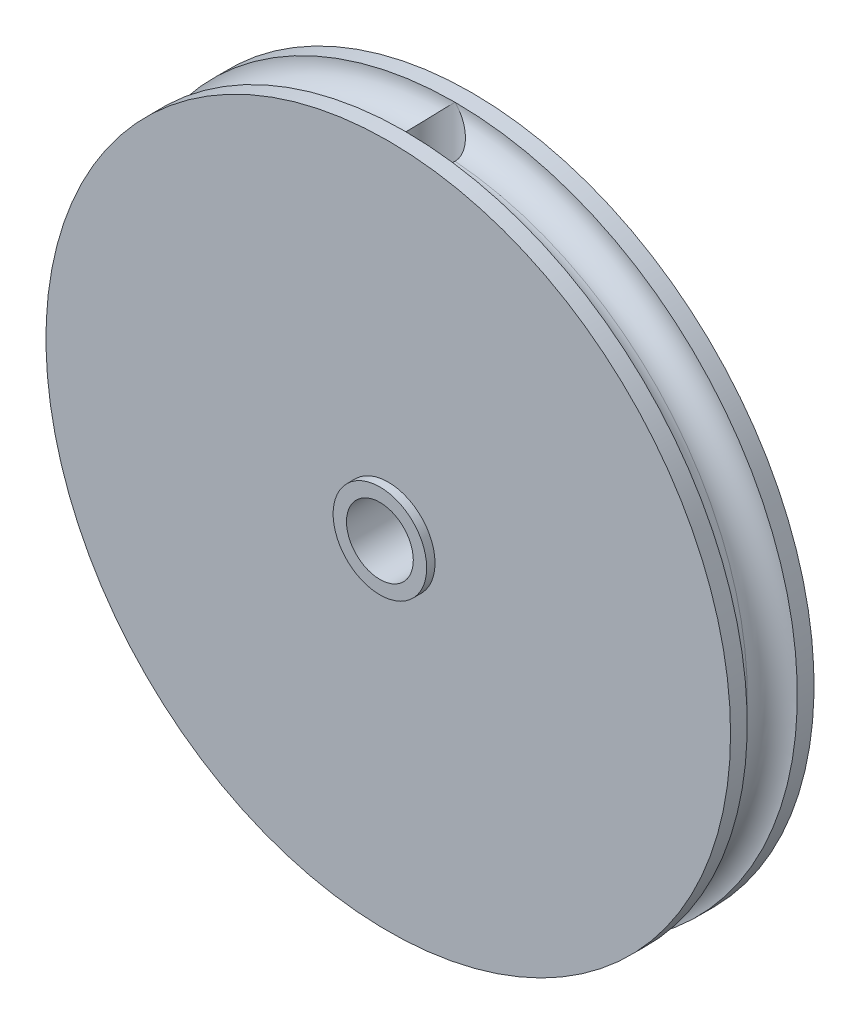
ISO-10303-21;
HEADER;
FILE_DESCRIPTION(('STEP AP214'),'2;1');
FILE_NAME('part.step','',(''),(''),'','','');
FILE_SCHEMA(('AUTOMOTIVE_DESIGN { 1 0 10303 214 1 1 1 1 }'));
ENDSEC;
DATA;
#1=APPLICATION_CONTEXT('core data for automotive mechanical design processes');
#2=APPLICATION_PROTOCOL_DEFINITION('international standard','automotive_design',2000,#1);
#3=PRODUCT_CONTEXT('',#1,'mechanical');
#4=PRODUCT('Part','Part','',(#3));
#5=PRODUCT_RELATED_PRODUCT_CATEGORY('part','',(#4));
#6=PRODUCT_DEFINITION_FORMATION('','',#4);
#7=PRODUCT_DEFINITION_CONTEXT('part definition',#1,'design');
#8=PRODUCT_DEFINITION('design','',#6,#7);
#9=PRODUCT_DEFINITION_SHAPE('','',#8);
#10=(LENGTH_UNIT() NAMED_UNIT(*) SI_UNIT(.MILLI.,.METRE.));
#11=(NAMED_UNIT(*) PLANE_ANGLE_UNIT() SI_UNIT($,.RADIAN.));
#12=(NAMED_UNIT(*) SI_UNIT($,.STERADIAN.) SOLID_ANGLE_UNIT());
#13=UNCERTAINTY_MEASURE_WITH_UNIT(LENGTH_MEASURE(1.E-05),#10,'distance_accuracy_value','');
#14=(GEOMETRIC_REPRESENTATION_CONTEXT(3) GLOBAL_UNCERTAINTY_ASSIGNED_CONTEXT((#13)) GLOBAL_UNIT_ASSIGNED_CONTEXT((#10,
#11,#12)) REPRESENTATION_CONTEXT('',''));
#15=CARTESIAN_POINT('',(0.,0.,0.));
#16=DIRECTION('',(0.,0.,1.));
#17=DIRECTION('',(1.,0.,0.));
#18=AXIS2_PLACEMENT_3D('',#15,#16,#17);
#19=CARTESIAN_POINT('',(0.,0.,-1.));
#20=DIRECTION('',(0.,0.,-1.));
#21=DIRECTION('',(-1.,0.,0.));
#22=AXIS2_PLACEMENT_3D('',#19,#20,#21);
#23=PLANE('',#22);
#24=CARTESIAN_POINT('',(0.,0.,-1.));
#25=DIRECTION('',(0.,0.,-1.));
#26=DIRECTION('',(-1.,0.,0.));
#27=AXIS2_PLACEMENT_3D('',#24,#25,#26);
#28=CIRCLE('',#27,20.5);
#29=CARTESIAN_POINT('',(-20.5,0.,-1.));
#30=VERTEX_POINT('',#29);
#31=EDGE_CURVE('E135',#30,#30,#28,.T.);
#32=ORIENTED_EDGE('',*,*,#31,.T.);
#33=EDGE_LOOP('',(#32));
#34=FACE_BOUND('',#33,.T.);
#35=CARTESIAN_POINT('',(0.,0.,-1.));
#36=DIRECTION('',(0.,0.,-1.));
#37=DIRECTION('',(-1.,0.,0.));
#38=AXIS2_PLACEMENT_3D('',#35,#36,#37);
#39=CIRCLE('',#38,2.8);
#40=CARTESIAN_POINT('',(-2.8,0.,-1.));
#41=VERTEX_POINT('',#40);
#42=EDGE_CURVE('E138',#41,#41,#39,.T.);
#43=ORIENTED_EDGE('',*,*,#42,.F.);
#44=EDGE_LOOP('',(#43));
#45=FACE_BOUND('',#44,.T.);
#46=ADVANCED_FACE('F37',(#34,#45),#23,.T.);
#47=CARTESIAN_POINT('',(0.,0.,4.));
#48=DIRECTION('',(0.,0.,1.));
#49=DIRECTION('',(1.,0.,0.));
#50=AXIS2_PLACEMENT_3D('',#47,#48,#49);
#51=PLANE('',#50);
#52=CARTESIAN_POINT('',(0.,0.,4.));
#53=DIRECTION('',(0.,0.,1.));
#54=DIRECTION('',(1.,0.,0.));
#55=AXIS2_PLACEMENT_3D('',#52,#53,#54);
#56=CIRCLE('',#55,20.5);
#57=CARTESIAN_POINT('',(20.5,0.,4.));
#58=VERTEX_POINT('',#57);
#59=EDGE_CURVE('E112',#58,#58,#56,.T.);
#60=ORIENTED_EDGE('',*,*,#59,.T.);
#61=EDGE_LOOP('',(#60));
#62=FACE_BOUND('',#61,.T.);
#63=CARTESIAN_POINT('',(0.,0.,4.));
#64=DIRECTION('',(0.,0.,1.));
#65=DIRECTION('',(1.,0.,0.));
#66=AXIS2_PLACEMENT_3D('',#63,#64,#65);
#67=CIRCLE('',#66,2.8);
#68=CARTESIAN_POINT('',(2.8,0.,4.));
#69=VERTEX_POINT('',#68);
#70=EDGE_CURVE('E151',#69,#69,#67,.T.);
#71=ORIENTED_EDGE('',*,*,#70,.F.);
#72=EDGE_LOOP('',(#71));
#73=FACE_BOUND('',#72,.T.);
#74=ADVANCED_FACE('F122',(#62,#73),#51,.T.);
#75=CARTESIAN_POINT('',(0.,0.,4.));
#76=DIRECTION('',(0.,0.,-1.));
#77=DIRECTION('',(-1.,0.,0.));
#78=AXIS2_PLACEMENT_3D('',#75,#76,#77);
#79=CYLINDRICAL_SURFACE('',#78,2.);
#80=CARTESIAN_POINT('',(0.,2.,0.));
#81=CARTESIAN_POINT('',(0.0732207358411543,1.99999540196395,4.79201202260337E-06));
#82=CARTESIAN_POINT('',(0.146561062021485,1.99593645526274,0.00540502437449589));
#83=CARTESIAN_POINT('',(0.290936396286467,1.98006607281083,0.0266670634101595));
#84=CARTESIAN_POINT('',(0.361965136229004,1.96823514679854,0.0425551716500548));
#85=CARTESIAN_POINT('',(0.499234626631249,1.9379567495606,0.0837129092837701));
#86=CARTESIAN_POINT('',(0.565501615403737,1.91954951932009,0.108925513569174));
#87=CARTESIAN_POINT('',(0.692422335520753,1.87750556721694,0.167542344187228));
#88=CARTESIAN_POINT('',(0.753077701796332,1.85387037535483,0.200944174193518));
#89=CARTESIAN_POINT('',(0.873465937590145,1.80049544543983,0.278263011590822));
#90=CARTESIAN_POINT('',(0.932593229272032,1.77039308548439,0.322867329334072));
#91=CARTESIAN_POINT('',(1.04302716767671,1.70767017883378,0.419495837361171));
#92=CARTESIAN_POINT('',(1.09432148272226,1.67504578078609,0.471531482799832));
#93=CARTESIAN_POINT('',(1.19837161436623,1.6027112365199,0.593582953278367));
#94=CARTESIAN_POINT('',(1.24930578421204,1.56290854864639,0.665103677121704));
#95=CARTESIAN_POINT('',(1.33861998176348,1.48711444664135,0.817451012366545));
#96=CARTESIAN_POINT('',(1.37701716983077,1.45111786883675,0.898264697000309));
#97=CARTESIAN_POINT('',(1.42880627811788,1.39977155180179,1.03950283867623));
#98=CARTESIAN_POINT('',(1.44625674456539,1.38157751186733,1.09739069712838));
#99=CARTESIAN_POINT('',(1.47420672564844,1.35171594150685,1.21639273478492));
#100=CARTESIAN_POINT('',(1.48472215355267,1.34003347910832,1.27749917787479));
#101=CARTESIAN_POINT('',(1.49812822141445,1.32503759684553,1.40218258553077));
#102=CARTESIAN_POINT('',(1.50094954854207,1.32180026676597,1.46577680672405));
#103=CARTESIAN_POINT('',(1.49848213241869,1.32459531776068,1.59261491088157));
#104=CARTESIAN_POINT('',(1.49319048157349,1.33063102218113,1.65585866008744));
#105=CARTESIAN_POINT('',(1.47597739291882,1.34967623262519,1.77319134742579));
#106=CARTESIAN_POINT('',(1.46482486380817,1.36187157059871,1.82753637104618));
#107=CARTESIAN_POINT('',(1.43705671120733,1.39114192844939,1.93343887872088));
#108=CARTESIAN_POINT('',(1.42043583681172,1.40822163640769,1.98499362782359));
#109=CARTESIAN_POINT('',(1.37033064172535,1.45741769294306,2.11625638663415));
#110=CARTESIAN_POINT('',(1.3328014849398,1.49225649139232,2.19340041664351));
#111=CARTESIAN_POINT('',(1.24618023314519,1.56533298145196,2.33919652386908));
#112=CARTESIAN_POINT('',(1.19706004255878,1.60357878886109,2.40782733925466));
#113=CARTESIAN_POINT('',(1.08651604102135,1.68051672313145,2.53775339040365));
#114=CARTESIAN_POINT('',(1.02481375526037,1.71919586730239,2.59882060688148));
#115=CARTESIAN_POINT('',(0.89042252170959,1.79248037980972,2.71026364678116));
#116=CARTESIAN_POINT('',(0.817755054293757,1.8270934826376,2.76065992023038));
#117=CARTESIAN_POINT('',(0.677902080454143,1.88279726073643,2.83998079924033));
#118=CARTESIAN_POINT('',(0.61253987018562,1.90520770945008,2.87118459421578));
#119=CARTESIAN_POINT('',(0.476352173202087,1.94372904416948,2.92422488046386));
#120=CARTESIAN_POINT('',(0.405530141063767,1.95984387504352,2.94606723849928));
#121=CARTESIAN_POINT('',(0.259676232483519,1.98445588635989,2.97925336288644));
#122=CARTESIAN_POINT('',(0.184621281405943,1.99290592971749,2.99053217893863));
#123=CARTESIAN_POINT('',(0.0332012397969175,2.00115883659445,3.00154959737171));
#124=CARTESIAN_POINT('',(-0.0431632843727232,2.00096534845408,3.00129306869537));
#125=CARTESIAN_POINT('',(-0.186804217329625,1.99242547175873,2.98988913072681));
#126=CARTESIAN_POINT('',(-0.254222327546133,1.98490086600401,2.97983946311133));
#127=CARTESIAN_POINT('',(-0.386110670609118,1.96351320201588,2.95102621999213));
#128=CARTESIAN_POINT('',(-0.450580272987261,1.94964879507262,2.93226079031059));
#129=CARTESIAN_POINT('',(-0.577416779689769,1.91599830683313,2.8861124694069));
#130=CARTESIAN_POINT('',(-0.639629172536138,1.89602050290193,2.8584488185726));
#131=CARTESIAN_POINT('',(-0.758518527043072,1.85166985411963,2.79582754457441));
#132=CARTESIAN_POINT('',(-0.815194721336403,1.82729640132068,2.76086891236027));
#133=CARTESIAN_POINT('',(-0.931511626319037,1.77119146886499,2.67821675358944));
#134=CARTESIAN_POINT('',(-0.990066762698702,1.73891095025037,2.62937146056254));
#135=CARTESIAN_POINT('',(-1.09871974855854,1.67238952874785,2.52399124741161));
#136=CARTESIAN_POINT('',(-1.14879830469577,1.63814438507395,2.46743930030664));
#137=CARTESIAN_POINT('',(-1.24877541075626,1.56369128291497,2.33585011903882));
#138=CARTESIAN_POINT('',(-1.29683043648705,1.52358718520101,2.2593424385077));
#139=CARTESIAN_POINT('',(-1.37923235998283,1.44940591348451,2.09663992202755));
#140=CARTESIAN_POINT('',(-1.41362000515519,1.41531099570969,2.01047487809143));
#141=CARTESIAN_POINT('',(-1.45615734256767,1.37118877808583,1.86458555112552));
#142=CARTESIAN_POINT('',(-1.46931009512996,1.35695811824565,1.80760887359762));
#143=CARTESIAN_POINT('',(-1.48891522181906,1.33542056103011,1.69129295301682));
#144=CARTESIAN_POINT('',(-1.4953825519924,1.32809821220233,1.63195929319775));
#145=CARTESIAN_POINT('',(-1.50115320209064,1.32157601792209,1.51217092018867));
#146=CARTESIAN_POINT('',(-1.50042015325262,1.32241740684975,1.45171205699043));
#147=CARTESIAN_POINT('',(-1.49176883838219,1.33216448543666,1.33194316124784));
#148=CARTESIAN_POINT('',(-1.48384130024585,1.34108058157484,1.27263471210274));
#149=CARTESIAN_POINT('',(-1.45893841819723,1.36817348797773,1.1440854285892));
#150=CARTESIAN_POINT('',(-1.44036567954111,1.38794705950643,1.07550281986723));
#151=CARTESIAN_POINT('',(-1.39469627266119,1.4338296338541,0.943465151169516));
#152=CARTESIAN_POINT('',(-1.3675780729773,1.4599546014693,0.880023557961812));
#153=CARTESIAN_POINT('',(-1.29498918933643,1.52516477328824,0.737479369513667));
#154=CARTESIAN_POINT('',(-1.2464154206597,1.56560203191105,0.660578417244247));
#155=CARTESIAN_POINT('',(-1.13650718465936,1.64713510181273,0.516873955022437));
#156=CARTESIAN_POINT('',(-1.07516134758577,1.68823146954222,0.450079534055154));
#157=CARTESIAN_POINT('',(-0.939627144937892,1.76728988939793,0.327168157716671));
#158=CARTESIAN_POINT('',(-0.865337161562861,1.80522333711072,0.271143680622806));
#159=CARTESIAN_POINT('',(-0.705159098936205,1.87357289668097,0.172776948854649));
#160=CARTESIAN_POINT('',(-0.619299420401795,1.90400691592959,0.130402025427495));
#161=CARTESIAN_POINT('',(-0.464840290356456,1.94636704624048,0.0722005790142935));
#162=CARTESIAN_POINT('',(-0.398553614774734,1.96110322499718,0.0522332686238256));
#163=CARTESIAN_POINT('',(-0.262841610392762,1.98383739970238,0.0215820973885094));
#164=CARTESIAN_POINT('',(-0.193425623834908,1.99185421210894,0.0108723097500385));
#165=CARTESIAN_POINT('',(-0.102963309861891,1.99745471706309,0.00339530578565107));
#166=CARTESIAN_POINT('',(-0.082406945994125,1.9984076143208,0.00212372251058427));
#167=CARTESIAN_POINT('',(-0.0412368896243789,1.99968095423138,0.000425326769030852));
#168=CARTESIAN_POINT('',(-0.0206231884283884,2.00000129507253,-1.34970737152924E-06));
#169=CARTESIAN_POINT('',(0.,2.,0.));
#170=B_SPLINE_CURVE_WITH_KNOTS('',3,(#80,#81,#82,#83,#84,#85,#86,#87,#88,#89,#90,#91,#92,#93,
#94,#95,#96,#97,#98,#99,#100,#101,#102,#103,#104,#105,#106,#107,#108,#109,#110,#111,#112,#113,
#114,#115,#116,#117,#118,#119,#120,#121,#122,#123,#124,#125,#126,#127,#128,#129,#130,#131,#132,
#133,#134,#135,#136,#137,#138,#139,#140,#141,#142,#143,#144,#145,#146,#147,#148,#149,#150,#151,
#152,#153,#154,#155,#156,#157,#158,#159,#160,#161,#162,#163,#164,#165,#166,#167,#168,#169),
.UNSPECIFIED.,.T.,.F.,(4,2,2,2,2,2,2,2,2,2,2,2,2,2,2,2,2,2,2,2,2,2,2,2,2,2,2,2,2,2,2,2,2,2,2,2,
2,2,2,2,2,2,2,2,4),(0.,0.219571786572042,0.439696319423244,0.658496333573381,0.877232398849293,
1.1162243131743,1.35558868405162,1.64360015887451,1.93121574056507,2.11999518529901,
2.3083399319529,2.49837587621257,2.6884799430021,2.85826890162709,3.0282213760064,
3.3044933180591,3.58144192357889,3.8653588393809,4.14872662493691,4.37526505006389,
4.60166129643117,4.82944058166898,5.05712372466613,5.26191187011994,5.46674360185812,
5.6788043948368,5.89089453977541,6.13840382081868,6.38646908985452,6.68168596015947,
6.97601595850112,7.15589161422933,7.33536399114208,7.51574333854741,7.69635548563854,
7.91639670960135,8.13699685139921,8.43412246655768,8.73151372390893,9.0313544949265,
9.33047220273164,9.5419569754163,9.75284752283256,9.81468166878711,9.87652576630966),.UNSPECIFIED.);
#171=CARTESIAN_POINT('',(0.,2.,0.));
#172=VERTEX_POINT('',#171);
#173=EDGE_CURVE('E100',#172,#172,#170,.T.);
#174=ORIENTED_EDGE('',*,*,#173,.F.);
#175=EDGE_LOOP('',(#174));
#176=FACE_BOUND('',#175,.T.);
#177=CARTESIAN_POINT('',(0.,0.,4.5));
#178=DIRECTION('',(0.,0.,1.));
#179=DIRECTION('',(1.,0.,0.));
#180=AXIS2_PLACEMENT_3D('',#177,#178,#179);
#181=CIRCLE('',#180,2.);
#182=CARTESIAN_POINT('',(2.,0.,4.5));
#183=VERTEX_POINT('',#182);
#184=EDGE_CURVE('E144',#183,#183,#181,.T.);
#185=ORIENTED_EDGE('',*,*,#184,.T.);
#186=EDGE_LOOP('',(#185));
#187=FACE_BOUND('',#186,.T.);
#188=CARTESIAN_POINT('',(0.,0.,-1.5));
#189=DIRECTION('',(0.,0.,-1.));
#190=DIRECTION('',(-1.,0.,0.));
#191=AXIS2_PLACEMENT_3D('',#188,#189,#190);
#192=CIRCLE('',#191,2.);
#193=CARTESIAN_POINT('',(-2.,0.,-1.5));
#194=VERTEX_POINT('',#193);
#195=EDGE_CURVE('E141',#194,#194,#192,.T.);
#196=ORIENTED_EDGE('',*,*,#195,.T.);
#197=EDGE_LOOP('',(#196));
#198=FACE_BOUND('',#197,.T.);
#199=ADVANCED_FACE('F94',(#176,#187,#198),#79,.F.);
#200=CARTESIAN_POINT('',(0.,0.,4.));
#201=DIRECTION('',(0.,0.,-1.));
#202=DIRECTION('',(-1.,0.,0.));
#203=AXIS2_PLACEMENT_3D('',#200,#201,#202);
#204=CYLINDRICAL_SURFACE('',#203,20.5);
#205=ORIENTED_EDGE('',*,*,#59,.F.);
#206=EDGE_LOOP('',(#205));
#207=FACE_BOUND('',#206,.T.);
#208=CARTESIAN_POINT('',(0.,0.,3.));
#209=DIRECTION('',(0.,0.,1.));
#210=DIRECTION('',(1.,0.,0.));
#211=AXIS2_PLACEMENT_3D('',#208,#209,#210);
#212=CIRCLE('',#211,20.5);
#213=CARTESIAN_POINT('',(0.,20.5,3.));
#214=VERTEX_POINT('',#213);
#215=EDGE_CURVE('E66',#214,#214,#212,.T.);
#216=ORIENTED_EDGE('',*,*,#215,.T.);
#217=EDGE_LOOP('',(#216));
#218=FACE_BOUND('',#217,.T.);
#219=ADVANCED_FACE('F117',(#207,#218),#204,.T.);
#220=CARTESIAN_POINT('',(0.,0.,-1.));
#221=DIRECTION('',(0.,0.,1.));
#222=DIRECTION('',(1.,0.,0.));
#223=AXIS2_PLACEMENT_3D('',#220,#221,#222);
#224=CYLINDRICAL_SURFACE('',#223,20.5);
#225=ORIENTED_EDGE('',*,*,#31,.F.);
#226=EDGE_LOOP('',(#225));
#227=FACE_BOUND('',#226,.T.);
#228=CARTESIAN_POINT('',(0.,0.,0.));
#229=DIRECTION('',(0.,0.,-1.));
#230=DIRECTION('',(-1.,0.,0.));
#231=AXIS2_PLACEMENT_3D('',#228,#229,#230);
#232=CIRCLE('',#231,20.5);
#233=CARTESIAN_POINT('',(0.,20.5,0.));
#234=VERTEX_POINT('',#233);
#235=EDGE_CURVE('E158',#234,#234,#232,.T.);
#236=ORIENTED_EDGE('',*,*,#235,.T.);
#237=EDGE_LOOP('',(#236));
#238=FACE_BOUND('',#237,.T.);
#239=ADVANCED_FACE('F91',(#227,#238),#224,.T.);
#240=CARTESIAN_POINT('',(0.,20.5,1.5));
#241=DIRECTION('',(0.,-1.,0.));
#242=DIRECTION('',(0.,0.,-1.));
#243=AXIS2_PLACEMENT_3D('',#240,#241,#242);
#244=CYLINDRICAL_SURFACE('',#243,1.5);
#245=CARTESIAN_POINT('',(-1.5,18.9406969248758,1.5));
#246=CARTESIAN_POINT('',(-1.50000879830353,18.9406869583156,1.46700162156007));
#247=CARTESIAN_POINT('',(-1.49891142469272,18.9418751092198,1.43401068428318));
#248=CARTESIAN_POINT('',(-1.49457234269412,18.9465707691481,1.36836606700722));
#249=CARTESIAN_POINT('',(-1.49133262323378,18.9500761269051,1.33571210269678));
#250=CARTESIAN_POINT('',(-1.48281744288391,18.9592854425843,1.27131022680939));
#251=CARTESIAN_POINT('',(-1.47756169894795,18.9649681056142,1.23955664322668));
#252=CARTESIAN_POINT('',(-1.46513272954799,18.9783983352455,1.17687716423226));
#253=CARTESIAN_POINT('',(-1.45795916812939,18.98614626363,1.14595141488201));
#254=CARTESIAN_POINT('',(-1.43382191160503,19.0121961474526,1.05494498011915));
#255=CARTESIAN_POINT('',(-1.41420196083709,19.0333472386929,0.996348775979359));
#256=CARTESIAN_POINT('',(-1.36909002194576,19.0818735715564,0.884148727346115));
#257=CARTESIAN_POINT('',(-1.34358287909426,19.1092648742478,0.830558277516448));
#258=CARTESIAN_POINT('',(-1.27517749560478,19.1825335074157,0.705614379996612));
#259=CARTESIAN_POINT('',(-1.22965210620724,19.231145560311,0.637300883260031));
#260=CARTESIAN_POINT('',(-1.13156254512432,19.3354254393582,0.512113948747138));
#261=CARTESIAN_POINT('',(-1.07898408885971,19.3911075719784,0.455264329543352));
#262=CARTESIAN_POINT('',(-0.945732521371845,19.5315568425509,0.330797469571159));
#263=CARTESIAN_POINT('',(-0.862515023156353,19.6187387881835,0.2686411940971));
#264=CARTESIAN_POINT('',(-0.689757492067029,19.7984358168692,0.164171618506324));
#265=CARTESIAN_POINT('',(-0.600210271415395,19.8909569402662,0.121881307765471));
#266=CARTESIAN_POINT('',(-0.426999495510468,20.0686338433181,0.0594400898207945));
#267=CARTESIAN_POINT('',(-0.343725068899767,20.1535245669585,0.0374109316956956));
#268=CARTESIAN_POINT('',(-0.175521649666241,20.3238983889381,0.00786693107230823));
#269=CARTESIAN_POINT('',(-0.0905966545104607,20.4093797949653,0.000320589508805275));
#270=CARTESIAN_POINT('',(-0.00365132701337396,20.4963484305662,3.33757138121831E-06));
#271=CARTESIAN_POINT('',(-0.00182570475454971,20.4981742967797,4.58616365577116E-09));
#272=CARTESIAN_POINT('',(0.,20.5,0.));
#273=B_SPLINE_CURVE_WITH_KNOTS('',3,(#245,#246,#247,#248,#249,#250,#251,#252,#253,#254,#255,
#256,#257,#258,#259,#260,#261,#262,#263,#264,#265,#266,#267,#268,#269,#270,#271,#272),
.UNSPECIFIED.,.F.,.F.,(4,2,2,2,2,2,2,2,2,2,2,2,2,4),(0.,0.0989434576957214,0.197795186226441,
0.295703816093586,0.393629608402421,0.588616408937209,0.784110853114283,1.06872873027154,
1.35393200132077,1.75857371914086,2.16368255157833,2.52564508071158,2.88681947172598,
2.89456544488897),.UNSPECIFIED.);
#274=CARTESIAN_POINT('',(-1.5,18.9406969248758,1.5));
#275=VERTEX_POINT('',#274);
#276=EDGE_CURVE('E69',#234,#275,#273,.F.);
#277=ORIENTED_EDGE('',*,*,#276,.T.);
#278=CARTESIAN_POINT('',(-1.5,18.9406969248758,1.5));
#279=CARTESIAN_POINT('',(-1.50000879830353,18.9406869583156,1.53299837843993));
#280=CARTESIAN_POINT('',(-1.49891142469272,18.9418751092198,1.56598931571682));
#281=CARTESIAN_POINT('',(-1.49457234269412,18.9465707691481,1.63163393299278));
#282=CARTESIAN_POINT('',(-1.49133262323378,18.9500761269051,1.66428789730322));
#283=CARTESIAN_POINT('',(-1.48281744288391,18.9592854425843,1.72868977319061));
#284=CARTESIAN_POINT('',(-1.47756169894795,18.9649681056142,1.76044335677332));
#285=CARTESIAN_POINT('',(-1.46513272954799,18.9783983352455,1.82312283576774));
#286=CARTESIAN_POINT('',(-1.45795916812939,18.98614626363,1.85404858511799));
#287=CARTESIAN_POINT('',(-1.43382191160503,19.0121961474526,1.94505501988085));
#288=CARTESIAN_POINT('',(-1.41420196083709,19.0333472386929,2.00365122402064));
#289=CARTESIAN_POINT('',(-1.36909002194576,19.0818735715564,2.11585127265388));
#290=CARTESIAN_POINT('',(-1.34358287909426,19.1092648742478,2.16944172248355));
#291=CARTESIAN_POINT('',(-1.27517749560478,19.1825335074157,2.29438562000339));
#292=CARTESIAN_POINT('',(-1.22965210620724,19.231145560311,2.36269911673997));
#293=CARTESIAN_POINT('',(-1.13156254512432,19.3354254393582,2.48788605125286));
#294=CARTESIAN_POINT('',(-1.07898408885971,19.3911075719784,2.54473567045665));
#295=CARTESIAN_POINT('',(-0.945732521371846,19.5315568425509,2.66920253042884));
#296=CARTESIAN_POINT('',(-0.862515023156355,19.6187387881835,2.7313588059029));
#297=CARTESIAN_POINT('',(-0.689757492067027,19.7984358168692,2.83582838149368));
#298=CARTESIAN_POINT('',(-0.600210271415386,19.8909569402662,2.87811869223453));
#299=CARTESIAN_POINT('',(-0.426999495510477,20.0686338433182,2.94055991017921));
#300=CARTESIAN_POINT('',(-0.343725068899797,20.1535245669585,2.9625890683043));
#301=CARTESIAN_POINT('',(-0.175521649666207,20.3238983889381,2.99213306892769));
#302=CARTESIAN_POINT('',(-0.09059665451034,20.4093797949652,2.9996794104912));
#303=CARTESIAN_POINT('',(-0.00365132701336847,20.4963484305662,2.99999666242862));
#304=CARTESIAN_POINT('',(-0.00182570475454691,20.4981742967797,2.99999999541384));
#305=CARTESIAN_POINT('',(0.,20.5,3.));
#306=B_SPLINE_CURVE_WITH_KNOTS('',3,(#278,#279,#280,#281,#282,#283,#284,#285,#286,#287,#288,
#289,#290,#291,#292,#293,#294,#295,#296,#297,#298,#299,#300,#301,#302,#303,#304,#305),
.UNSPECIFIED.,.F.,.F.,(4,2,2,2,2,2,2,2,2,2,2,2,2,4),(0.,0.0989434576957212,0.197795186226441,
0.295703816093586,0.393629608402421,0.588616408937209,0.784110853114282,1.06872873027154,
1.35393200132077,1.75857371914086,2.16368255157833,2.52564508071158,2.88681947172598,
2.89456544488897),.UNSPECIFIED.);
#307=EDGE_CURVE('E11',#275,#214,#306,.T.);
#308=ORIENTED_EDGE('',*,*,#307,.T.);
#309=CARTESIAN_POINT('',(1.5,18.9406969248758,1.5));
#310=CARTESIAN_POINT('',(1.50000879830353,18.9406869583156,1.53299837843993));
#311=CARTESIAN_POINT('',(1.49891142469272,18.9418751092198,1.56598931571682));
#312=CARTESIAN_POINT('',(1.49457234269412,18.9465707691481,1.63163393299278));
#313=CARTESIAN_POINT('',(1.49133262323378,18.9500761269051,1.66428789730322));
#314=CARTESIAN_POINT('',(1.48281744288391,18.9592854425843,1.72868977319061));
#315=CARTESIAN_POINT('',(1.47756169894795,18.9649681056142,1.76044335677332));
#316=CARTESIAN_POINT('',(1.46513272954799,18.9783983352455,1.82312283576774));
#317=CARTESIAN_POINT('',(1.45795916812939,18.98614626363,1.85404858511799));
#318=CARTESIAN_POINT('',(1.43382191160503,19.0121961474526,1.94505501988085));
#319=CARTESIAN_POINT('',(1.41420196083709,19.0333472386929,2.00365122402064));
#320=CARTESIAN_POINT('',(1.36909002194576,19.0818735715564,2.11585127265388));
#321=CARTESIAN_POINT('',(1.34358287909426,19.1092648742478,2.16944172248355));
#322=CARTESIAN_POINT('',(1.27517749560478,19.1825335074157,2.29438562000339));
#323=CARTESIAN_POINT('',(1.22965210620724,19.231145560311,2.36269911673997));
#324=CARTESIAN_POINT('',(1.13156254512432,19.3354254393582,2.48788605125286));
#325=CARTESIAN_POINT('',(1.07898408885971,19.3911075719784,2.54473567045665));
#326=CARTESIAN_POINT('',(0.945732521371846,19.5315568425509,2.66920253042884));
#327=CARTESIAN_POINT('',(0.862515023156355,19.6187387881835,2.7313588059029));
#328=CARTESIAN_POINT('',(0.689757492067027,19.7984358168692,2.83582838149368));
#329=CARTESIAN_POINT('',(0.600210271415386,19.8909569402662,2.87811869223453));
#330=CARTESIAN_POINT('',(0.426999495510477,20.0686338433182,2.94055991017921));
#331=CARTESIAN_POINT('',(0.343725068899797,20.1535245669585,2.9625890683043));
#332=CARTESIAN_POINT('',(0.175521649666207,20.3238983889381,2.99213306892769));
#333=CARTESIAN_POINT('',(0.09059665451034,20.4093797949652,2.9996794104912));
#334=CARTESIAN_POINT('',(0.00365132701336847,20.4963484305662,2.99999666242862));
#335=CARTESIAN_POINT('',(0.00182570475454691,20.4981742967797,2.99999999541384));
#336=CARTESIAN_POINT('',(0.,20.5,3.));
#337=B_SPLINE_CURVE_WITH_KNOTS('',3,(#309,#310,#311,#312,#313,#314,#315,#316,#317,#318,#319,
#320,#321,#322,#323,#324,#325,#326,#327,#328,#329,#330,#331,#332,#333,#334,#335,#336),
.UNSPECIFIED.,.F.,.F.,(4,2,2,2,2,2,2,2,2,2,2,2,2,4),(0.,0.0989434576957212,0.197795186226441,
0.295703816093586,0.393629608402421,0.588616408937209,0.784110853114282,1.06872873027154,
1.35393200132077,1.75857371914086,2.16368255157833,2.52564508071158,2.88681947172598,
2.89456544488897),.UNSPECIFIED.);
#338=CARTESIAN_POINT('',(1.5,18.9406969248758,1.5));
#339=VERTEX_POINT('',#338);
#340=EDGE_CURVE('E47',#214,#339,#337,.F.);
#341=ORIENTED_EDGE('',*,*,#340,.T.);
#342=CARTESIAN_POINT('',(1.5,18.9406969248758,1.5));
#343=CARTESIAN_POINT('',(1.50000879830353,18.9406869583156,1.46700162156007));
#344=CARTESIAN_POINT('',(1.49891142469272,18.9418751092198,1.43401068428318));
#345=CARTESIAN_POINT('',(1.49457234269412,18.9465707691481,1.36836606700722));
#346=CARTESIAN_POINT('',(1.49133262323378,18.9500761269051,1.33571210269678));
#347=CARTESIAN_POINT('',(1.48281744288391,18.9592854425843,1.27131022680939));
#348=CARTESIAN_POINT('',(1.47756169894795,18.9649681056142,1.23955664322668));
#349=CARTESIAN_POINT('',(1.46513272954799,18.9783983352455,1.17687716423226));
#350=CARTESIAN_POINT('',(1.45795916812939,18.98614626363,1.14595141488201));
#351=CARTESIAN_POINT('',(1.43382191160503,19.0121961474526,1.05494498011915));
#352=CARTESIAN_POINT('',(1.41420196083709,19.0333472386929,0.996348775979359));
#353=CARTESIAN_POINT('',(1.36909002194576,19.0818735715564,0.884148727346115));
#354=CARTESIAN_POINT('',(1.34358287909426,19.1092648742478,0.830558277516448));
#355=CARTESIAN_POINT('',(1.27517749560478,19.1825335074157,0.705614379996612));
#356=CARTESIAN_POINT('',(1.22965210620724,19.231145560311,0.637300883260031));
#357=CARTESIAN_POINT('',(1.13156254512432,19.3354254393582,0.512113948747138));
#358=CARTESIAN_POINT('',(1.07898408885971,19.3911075719784,0.455264329543352));
#359=CARTESIAN_POINT('',(0.945732521371845,19.5315568425509,0.330797469571159));
#360=CARTESIAN_POINT('',(0.862515023156353,19.6187387881835,0.2686411940971));
#361=CARTESIAN_POINT('',(0.689757492067029,19.7984358168692,0.164171618506324));
#362=CARTESIAN_POINT('',(0.600210271415395,19.8909569402662,0.121881307765471));
#363=CARTESIAN_POINT('',(0.426999495510468,20.0686338433181,0.0594400898207945));
#364=CARTESIAN_POINT('',(0.343725068899767,20.1535245669585,0.0374109316956956));
#365=CARTESIAN_POINT('',(0.175521649666241,20.3238983889381,0.00786693107230823));
#366=CARTESIAN_POINT('',(0.0905966545104607,20.4093797949653,0.000320589508805275));
#367=CARTESIAN_POINT('',(0.00365132701337396,20.4963484305662,3.33757138121831E-06));
#368=CARTESIAN_POINT('',(0.00182570475454971,20.4981742967797,4.58616365577116E-09));
#369=CARTESIAN_POINT('',(0.,20.5,0.));
#370=B_SPLINE_CURVE_WITH_KNOTS('',3,(#342,#343,#344,#345,#346,#347,#348,#349,#350,#351,#352,
#353,#354,#355,#356,#357,#358,#359,#360,#361,#362,#363,#364,#365,#366,#367,#368,#369),
.UNSPECIFIED.,.F.,.F.,(4,2,2,2,2,2,2,2,2,2,2,2,2,4),(0.,0.0989434576957214,0.197795186226441,
0.295703816093586,0.393629608402421,0.588616408937209,0.784110853114283,1.06872873027154,
1.35393200132077,1.75857371914086,2.16368255157833,2.52564508071158,2.88681947172598,
2.89456544488897),.UNSPECIFIED.);
#371=EDGE_CURVE('E67',#339,#234,#370,.T.);
#372=ORIENTED_EDGE('',*,*,#371,.T.);
#373=EDGE_LOOP('',(#277,#308,#341,#372));
#374=FACE_BOUND('',#373,.T.);
#375=ORIENTED_EDGE('',*,*,#173,.T.);
#376=EDGE_LOOP('',(#375));
#377=FACE_BOUND('',#376,.T.);
#378=ADVANCED_FACE('F85',(#374,#377),#244,.F.);
#379=CARTESIAN_POINT('',(0.,0.,4.5));
#380=DIRECTION('',(0.,0.,1.));
#381=DIRECTION('',(1.,0.,0.));
#382=AXIS2_PLACEMENT_3D('',#379,#380,#381);
#383=PLANE('',#382);
#384=CARTESIAN_POINT('',(0.,0.,4.5));
#385=DIRECTION('',(0.,0.,1.));
#386=DIRECTION('',(1.,0.,0.));
#387=AXIS2_PLACEMENT_3D('',#384,#385,#386);
#388=CIRCLE('',#387,2.8);
#389=CARTESIAN_POINT('',(2.8,0.,4.5));
#390=VERTEX_POINT('',#389);
#391=EDGE_CURVE('E152',#390,#390,#388,.T.);
#392=ORIENTED_EDGE('',*,*,#391,.T.);
#393=EDGE_LOOP('',(#392));
#394=FACE_BOUND('',#393,.T.);
#395=ORIENTED_EDGE('',*,*,#184,.F.);
#396=EDGE_LOOP('',(#395));
#397=FACE_BOUND('',#396,.T.);
#398=ADVANCED_FACE('F90',(#394,#397),#383,.T.);
#399=CARTESIAN_POINT('',(0.,0.,4.5));
#400=DIRECTION('',(0.,0.,-1.));
#401=DIRECTION('',(-1.,0.,0.));
#402=AXIS2_PLACEMENT_3D('',#399,#400,#401);
#403=CYLINDRICAL_SURFACE('',#402,2.8);
#404=ORIENTED_EDGE('',*,*,#391,.F.);
#405=EDGE_LOOP('',(#404));
#406=FACE_BOUND('',#405,.T.);
#407=ORIENTED_EDGE('',*,*,#70,.T.);
#408=EDGE_LOOP('',(#407));
#409=FACE_BOUND('',#408,.T.);
#410=ADVANCED_FACE('F92',(#406,#409),#403,.T.);
#411=CARTESIAN_POINT('',(0.,0.,-1.5));
#412=DIRECTION('',(0.,0.,-1.));
#413=DIRECTION('',(-1.,0.,0.));
#414=AXIS2_PLACEMENT_3D('',#411,#412,#413);
#415=PLANE('',#414);
#416=CARTESIAN_POINT('',(0.,0.,-1.5));
#417=DIRECTION('',(0.,0.,-1.));
#418=DIRECTION('',(-1.,0.,0.));
#419=AXIS2_PLACEMENT_3D('',#416,#417,#418);
#420=CIRCLE('',#419,2.8);
#421=CARTESIAN_POINT('',(-2.8,0.,-1.5));
#422=VERTEX_POINT('',#421);
#423=EDGE_CURVE('E140',#422,#422,#420,.T.);
#424=ORIENTED_EDGE('',*,*,#423,.T.);
#425=EDGE_LOOP('',(#424));
#426=FACE_BOUND('',#425,.T.);
#427=ORIENTED_EDGE('',*,*,#195,.F.);
#428=EDGE_LOOP('',(#427));
#429=FACE_BOUND('',#428,.T.);
#430=ADVANCED_FACE('F168',(#426,#429),#415,.T.);
#431=CARTESIAN_POINT('',(0.,0.,-1.5));
#432=DIRECTION('',(0.,0.,1.));
#433=DIRECTION('',(1.,0.,0.));
#434=AXIS2_PLACEMENT_3D('',#431,#432,#433);
#435=CYLINDRICAL_SURFACE('',#434,2.8);
#436=ORIENTED_EDGE('',*,*,#423,.F.);
#437=EDGE_LOOP('',(#436));
#438=FACE_BOUND('',#437,.T.);
#439=ORIENTED_EDGE('',*,*,#42,.T.);
#440=EDGE_LOOP('',(#439));
#441=FACE_BOUND('',#440,.T.);
#442=ADVANCED_FACE('F174',(#438,#441),#435,.T.);
#443=CARTESIAN_POINT('',(0.,0.,1.5));
#444=DIRECTION('',(0.,0.,1.));
#445=DIRECTION('',(1.,0.,0.));
#446=AXIS2_PLACEMENT_3D('',#443,#444,#445);
#447=TOROIDAL_SURFACE('',#446,20.5,1.5);
#448=CARTESIAN_POINT('',(0.,0.,1.5));
#449=DIRECTION('',(0.,0.,1.));
#450=DIRECTION('',(1.,0.,0.));
#451=AXIS2_PLACEMENT_3D('',#448,#449,#450);
#452=CIRCLE('',#451,19.);
#453=EDGE_CURVE('E42',#339,#275,#452,.F.);
#454=ORIENTED_EDGE('',*,*,#453,.F.);
#455=ORIENTED_EDGE('',*,*,#340,.F.);
#456=ORIENTED_EDGE('',*,*,#215,.F.);
#457=ORIENTED_EDGE('',*,*,#307,.F.);
#458=EDGE_LOOP('',(#454,#455,#456,#457));
#459=FACE_BOUND('',#458,.T.);
#460=ADVANCED_FACE('F39',(#459),#447,.F.);
#461=CARTESIAN_POINT('',(0.,0.,1.5));
#462=DIRECTION('',(0.,0.,-1.));
#463=DIRECTION('',(-1.,0.,0.));
#464=AXIS2_PLACEMENT_3D('',#461,#462,#463);
#465=TOROIDAL_SURFACE('',#464,20.5,1.5);
#466=ORIENTED_EDGE('',*,*,#371,.F.);
#467=ORIENTED_EDGE('',*,*,#453,.T.);
#468=ORIENTED_EDGE('',*,*,#276,.F.);
#469=ORIENTED_EDGE('',*,*,#235,.F.);
#470=EDGE_LOOP('',(#466,#467,#468,#469));
#471=FACE_BOUND('',#470,.T.);
#472=ADVANCED_FACE('F113',(#471),#465,.F.);
#473=CLOSED_SHELL('',(#46,#74,#199,#219,#239,#378,#398,#410,#430,#442,#460,#472));
#474=MANIFOLD_SOLID_BREP('B2',#473);
#475=ADVANCED_BREP_SHAPE_REPRESENTATION('',(#18,#474),#14);
#476=SHAPE_DEFINITION_REPRESENTATION(#9,#475);
ENDSEC;
END-ISO-10303-21;
